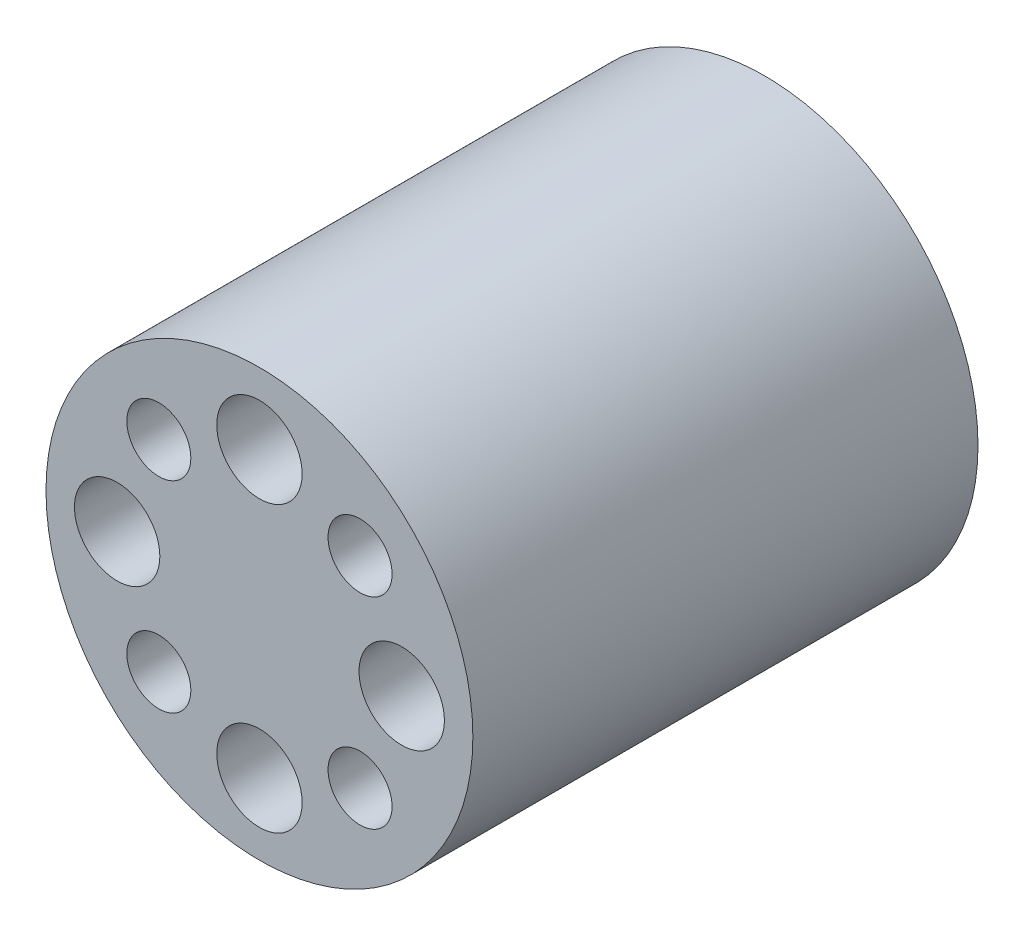
ISO-10303-21;
HEADER;
FILE_DESCRIPTION(('STEP AP214'),'2;1');
FILE_NAME('part.step','',(''),(''),'','','');
FILE_SCHEMA(('AUTOMOTIVE_DESIGN { 1 0 10303 214 1 1 1 1 }'));
ENDSEC;
DATA;
#1=APPLICATION_CONTEXT('core data for automotive mechanical design processes');
#2=APPLICATION_PROTOCOL_DEFINITION('international standard','automotive_design',2000,#1);
#3=PRODUCT_CONTEXT('',#1,'mechanical');
#4=PRODUCT('Part','Part','',(#3));
#5=PRODUCT_RELATED_PRODUCT_CATEGORY('part','',(#4));
#6=PRODUCT_DEFINITION_FORMATION('','',#4);
#7=PRODUCT_DEFINITION_CONTEXT('part definition',#1,'design');
#8=PRODUCT_DEFINITION('design','',#6,#7);
#9=PRODUCT_DEFINITION_SHAPE('','',#8);
#10=(LENGTH_UNIT() NAMED_UNIT(*) SI_UNIT(.MILLI.,.METRE.));
#11=(NAMED_UNIT(*) PLANE_ANGLE_UNIT() SI_UNIT($,.RADIAN.));
#12=(NAMED_UNIT(*) SI_UNIT($,.STERADIAN.) SOLID_ANGLE_UNIT());
#13=UNCERTAINTY_MEASURE_WITH_UNIT(LENGTH_MEASURE(1.E-05),#10,'distance_accuracy_value','');
#14=(GEOMETRIC_REPRESENTATION_CONTEXT(3) GLOBAL_UNCERTAINTY_ASSIGNED_CONTEXT((#13)) GLOBAL_UNIT_ASSIGNED_CONTEXT((#10,
#11,#12)) REPRESENTATION_CONTEXT('',''));
#15=CARTESIAN_POINT('',(0.,0.,0.));
#16=DIRECTION('',(0.,0.,1.));
#17=DIRECTION('',(1.,0.,0.));
#18=AXIS2_PLACEMENT_3D('',#15,#16,#17);
#19=CARTESIAN_POINT('',(10.,0.,35.5));
#20=DIRECTION('',(0.,0.,-1.));
#21=DIRECTION('',(-1.,0.,0.));
#22=AXIS2_PLACEMENT_3D('',#19,#20,#21);
#23=CYLINDRICAL_SURFACE('',#22,1.65);
#24=CARTESIAN_POINT('',(10.,0.,0.));
#25=DIRECTION('',(0.,0.,1.));
#26=DIRECTION('',(1.,0.,0.));
#27=AXIS2_PLACEMENT_3D('',#24,#25,#26);
#28=CIRCLE('',#27,1.65);
#29=CARTESIAN_POINT('',(11.65,0.,0.));
#30=VERTEX_POINT('',#29);
#31=EDGE_CURVE('E53',#30,#30,#28,.T.);
#32=ORIENTED_EDGE('',*,*,#31,.F.);
#33=EDGE_LOOP('',(#32));
#34=FACE_BOUND('',#33,.T.);
#35=CARTESIAN_POINT('',(10.,0.,6.));
#36=DIRECTION('',(0.,0.,1.));
#37=DIRECTION('',(1.,0.,0.));
#38=AXIS2_PLACEMENT_3D('',#35,#36,#37);
#39=CIRCLE('',#38,1.65);
#40=CARTESIAN_POINT('',(11.65,0.,6.));
#41=VERTEX_POINT('',#40);
#42=EDGE_CURVE('E79',#41,#41,#39,.T.);
#43=ORIENTED_EDGE('',*,*,#42,.T.);
#44=EDGE_LOOP('',(#43));
#45=FACE_BOUND('',#44,.T.);
#46=ADVANCED_FACE('F41',(#34,#45),#23,.F.);
#47=CARTESIAN_POINT('',(0.,-10.,35.5));
#48=DIRECTION('',(0.,0.,-1.));
#49=DIRECTION('',(-1.,0.,0.));
#50=AXIS2_PLACEMENT_3D('',#47,#48,#49);
#51=CYLINDRICAL_SURFACE('',#50,1.65);
#52=CARTESIAN_POINT('',(0.,-10.,0.));
#53=DIRECTION('',(0.,0.,1.));
#54=DIRECTION('',(1.,0.,0.));
#55=AXIS2_PLACEMENT_3D('',#52,#53,#54);
#56=CIRCLE('',#55,1.65);
#57=CARTESIAN_POINT('',(1.65,-10.,0.));
#58=VERTEX_POINT('',#57);
#59=EDGE_CURVE('E65',#58,#58,#56,.T.);
#60=ORIENTED_EDGE('',*,*,#59,.F.);
#61=EDGE_LOOP('',(#60));
#62=FACE_BOUND('',#61,.T.);
#63=CARTESIAN_POINT('',(0.,-10.,6.));
#64=DIRECTION('',(0.,0.,1.));
#65=DIRECTION('',(1.,0.,0.));
#66=AXIS2_PLACEMENT_3D('',#63,#64,#65);
#67=CIRCLE('',#66,1.65);
#68=CARTESIAN_POINT('',(1.65,-10.,6.));
#69=VERTEX_POINT('',#68);
#70=EDGE_CURVE('E95',#69,#69,#67,.T.);
#71=ORIENTED_EDGE('',*,*,#70,.T.);
#72=EDGE_LOOP('',(#71));
#73=FACE_BOUND('',#72,.T.);
#74=ADVANCED_FACE('F75',(#62,#73),#51,.F.);
#75=CARTESIAN_POINT('',(-10.,0.,35.5));
#76=DIRECTION('',(0.,0.,-1.));
#77=DIRECTION('',(-1.,0.,0.));
#78=AXIS2_PLACEMENT_3D('',#75,#76,#77);
#79=CYLINDRICAL_SURFACE('',#78,1.65);
#80=CARTESIAN_POINT('',(-10.,0.,0.));
#81=DIRECTION('',(0.,0.,1.));
#82=DIRECTION('',(1.,0.,0.));
#83=AXIS2_PLACEMENT_3D('',#80,#81,#82);
#84=CIRCLE('',#83,1.65);
#85=CARTESIAN_POINT('',(-8.35,0.,0.));
#86=VERTEX_POINT('',#85);
#87=EDGE_CURVE('E61',#86,#86,#84,.T.);
#88=ORIENTED_EDGE('',*,*,#87,.F.);
#89=EDGE_LOOP('',(#88));
#90=FACE_BOUND('',#89,.T.);
#91=CARTESIAN_POINT('',(-10.,0.,6.));
#92=DIRECTION('',(0.,0.,1.));
#93=DIRECTION('',(1.,0.,0.));
#94=AXIS2_PLACEMENT_3D('',#91,#92,#93);
#95=CIRCLE('',#94,1.65);
#96=CARTESIAN_POINT('',(-8.35,0.,6.));
#97=VERTEX_POINT('',#96);
#98=EDGE_CURVE('E105',#97,#97,#95,.T.);
#99=ORIENTED_EDGE('',*,*,#98,.T.);
#100=EDGE_LOOP('',(#99));
#101=FACE_BOUND('',#100,.T.);
#102=ADVANCED_FACE('F157',(#90,#101),#79,.F.);
#103=CARTESIAN_POINT('',(0.,10.,35.5));
#104=DIRECTION('',(0.,0.,-1.));
#105=DIRECTION('',(-1.,0.,0.));
#106=AXIS2_PLACEMENT_3D('',#103,#104,#105);
#107=CYLINDRICAL_SURFACE('',#106,1.65);
#108=CARTESIAN_POINT('',(0.,10.,0.));
#109=DIRECTION('',(0.,0.,1.));
#110=DIRECTION('',(1.,0.,0.));
#111=AXIS2_PLACEMENT_3D('',#108,#109,#110);
#112=CIRCLE('',#111,1.65);
#113=CARTESIAN_POINT('',(1.65,10.,0.));
#114=VERTEX_POINT('',#113);
#115=EDGE_CURVE('E58',#114,#114,#112,.T.);
#116=ORIENTED_EDGE('',*,*,#115,.F.);
#117=EDGE_LOOP('',(#116));
#118=FACE_BOUND('',#117,.T.);
#119=CARTESIAN_POINT('',(0.,10.,6.));
#120=DIRECTION('',(0.,0.,1.));
#121=DIRECTION('',(1.,0.,0.));
#122=AXIS2_PLACEMENT_3D('',#119,#120,#121);
#123=CIRCLE('',#122,1.65);
#124=CARTESIAN_POINT('',(1.65,10.,6.));
#125=VERTEX_POINT('',#124);
#126=EDGE_CURVE('E85',#125,#125,#123,.T.);
#127=ORIENTED_EDGE('',*,*,#126,.T.);
#128=EDGE_LOOP('',(#127));
#129=FACE_BOUND('',#128,.T.);
#130=ADVANCED_FACE('F43',(#118,#129),#107,.F.);
#131=CARTESIAN_POINT('',(0.,0.,35.5));
#132=DIRECTION('',(0.,0.,-1.));
#133=DIRECTION('',(-1.,0.,0.));
#134=AXIS2_PLACEMENT_3D('',#131,#132,#133);
#135=CYLINDRICAL_SURFACE('',#134,15.);
#136=CARTESIAN_POINT('',(0.,0.,35.5));
#137=DIRECTION('',(0.,0.,1.));
#138=DIRECTION('',(1.,0.,0.));
#139=AXIS2_PLACEMENT_3D('',#136,#137,#138);
#140=CIRCLE('',#139,15.);
#141=CARTESIAN_POINT('',(15.,0.,35.5));
#142=VERTEX_POINT('',#141);
#143=EDGE_CURVE('E11',#142,#142,#140,.T.);
#144=ORIENTED_EDGE('',*,*,#143,.F.);
#145=EDGE_LOOP('',(#144));
#146=FACE_BOUND('',#145,.T.);
#147=CARTESIAN_POINT('',(0.,0.,0.));
#148=DIRECTION('',(0.,0.,1.));
#149=DIRECTION('',(1.,0.,0.));
#150=AXIS2_PLACEMENT_3D('',#147,#148,#149);
#151=CIRCLE('',#150,15.);
#152=CARTESIAN_POINT('',(15.,0.,0.));
#153=VERTEX_POINT('',#152);
#154=EDGE_CURVE('E45',#153,#153,#151,.T.);
#155=ORIENTED_EDGE('',*,*,#154,.T.);
#156=EDGE_LOOP('',(#155));
#157=FACE_BOUND('',#156,.T.);
#158=ADVANCED_FACE('F138',(#146,#157),#135,.T.);
#159=CARTESIAN_POINT('',(0.,0.,35.5));
#160=DIRECTION('',(0.,0.,1.));
#161=DIRECTION('',(1.,0.,0.));
#162=AXIS2_PLACEMENT_3D('',#159,#160,#161);
#163=PLANE('',#162);
#164=CARTESIAN_POINT('',(0.,10.,35.5));
#165=DIRECTION('',(0.,0.,1.));
#166=DIRECTION('',(1.,0.,0.));
#167=AXIS2_PLACEMENT_3D('',#164,#165,#166);
#168=CIRCLE('',#167,3.);
#169=CARTESIAN_POINT('',(3.,10.,35.5));
#170=VERTEX_POINT('',#169);
#171=EDGE_CURVE('E81',#170,#170,#168,.T.);
#172=ORIENTED_EDGE('',*,*,#171,.F.);
#173=EDGE_LOOP('',(#172));
#174=FACE_BOUND('',#173,.T.);
#175=CARTESIAN_POINT('',(10.,0.,35.5));
#176=DIRECTION('',(0.,0.,1.));
#177=DIRECTION('',(1.,0.,0.));
#178=AXIS2_PLACEMENT_3D('',#175,#176,#177);
#179=CIRCLE('',#178,3.);
#180=CARTESIAN_POINT('',(13.,0.,35.5));
#181=VERTEX_POINT('',#180);
#182=EDGE_CURVE('E88',#181,#181,#179,.T.);
#183=ORIENTED_EDGE('',*,*,#182,.F.);
#184=EDGE_LOOP('',(#183));
#185=FACE_BOUND('',#184,.T.);
#186=CARTESIAN_POINT('',(0.,-10.,35.5));
#187=DIRECTION('',(0.,0.,1.));
#188=DIRECTION('',(1.,0.,0.));
#189=AXIS2_PLACEMENT_3D('',#186,#187,#188);
#190=CIRCLE('',#189,3.);
#191=CARTESIAN_POINT('',(3.,-10.,35.5));
#192=VERTEX_POINT('',#191);
#193=EDGE_CURVE('E92',#192,#192,#190,.T.);
#194=ORIENTED_EDGE('',*,*,#193,.F.);
#195=EDGE_LOOP('',(#194));
#196=FACE_BOUND('',#195,.T.);
#197=CARTESIAN_POINT('',(-10.,0.,35.5));
#198=DIRECTION('',(0.,0.,1.));
#199=DIRECTION('',(1.,0.,0.));
#200=AXIS2_PLACEMENT_3D('',#197,#198,#199);
#201=CIRCLE('',#200,3.);
#202=CARTESIAN_POINT('',(-7.,0.,35.5));
#203=VERTEX_POINT('',#202);
#204=EDGE_CURVE('E102',#203,#203,#201,.T.);
#205=ORIENTED_EDGE('',*,*,#204,.F.);
#206=EDGE_LOOP('',(#205));
#207=FACE_BOUND('',#206,.T.);
#208=CARTESIAN_POINT('',(-7.07106781186546,-7.07106781186549,35.5));
#209=DIRECTION('',(0.,0.,1.));
#210=DIRECTION('',(1.,0.,0.));
#211=AXIS2_PLACEMENT_3D('',#208,#209,#210);
#212=CIRCLE('',#211,2.25);
#213=CARTESIAN_POINT('',(-4.82106781186546,-7.07106781186549,35.5));
#214=VERTEX_POINT('',#213);
#215=EDGE_CURVE('E122',#214,#214,#212,.T.);
#216=ORIENTED_EDGE('',*,*,#215,.F.);
#217=EDGE_LOOP('',(#216));
#218=FACE_BOUND('',#217,.T.);
#219=CARTESIAN_POINT('',(7.07106781186549,-7.07106781186547,35.5));
#220=DIRECTION('',(0.,0.,1.));
#221=DIRECTION('',(1.,0.,0.));
#222=AXIS2_PLACEMENT_3D('',#219,#220,#221);
#223=CIRCLE('',#222,2.25);
#224=CARTESIAN_POINT('',(9.32106781186549,-7.07106781186547,35.5));
#225=VERTEX_POINT('',#224);
#226=EDGE_CURVE('E116',#225,#225,#223,.T.);
#227=ORIENTED_EDGE('',*,*,#226,.F.);
#228=EDGE_LOOP('',(#227));
#229=FACE_BOUND('',#228,.T.);
#230=CARTESIAN_POINT('',(7.07106781186546,7.07106781186549,35.5));
#231=DIRECTION('',(0.,0.,1.));
#232=DIRECTION('',(1.,0.,0.));
#233=AXIS2_PLACEMENT_3D('',#230,#231,#232);
#234=CIRCLE('',#233,2.25);
#235=CARTESIAN_POINT('',(9.32106781186547,7.07106781186549,35.5));
#236=VERTEX_POINT('',#235);
#237=EDGE_CURVE('E110',#236,#236,#234,.T.);
#238=ORIENTED_EDGE('',*,*,#237,.F.);
#239=EDGE_LOOP('',(#238));
#240=FACE_BOUND('',#239,.T.);
#241=CARTESIAN_POINT('',(-7.07106781186549,7.07106781186546,35.5));
#242=DIRECTION('',(0.,0.,1.));
#243=DIRECTION('',(1.,0.,0.));
#244=AXIS2_PLACEMENT_3D('',#241,#242,#243);
#245=CIRCLE('',#244,2.25);
#246=CARTESIAN_POINT('',(-4.82106781186549,7.07106781186546,35.5));
#247=VERTEX_POINT('',#246);
#248=EDGE_CURVE('E56',#247,#247,#245,.T.);
#249=ORIENTED_EDGE('',*,*,#248,.F.);
#250=EDGE_LOOP('',(#249));
#251=FACE_BOUND('',#250,.T.);
#252=ORIENTED_EDGE('',*,*,#143,.T.);
#253=EDGE_LOOP('',(#252));
#254=FACE_BOUND('',#253,.T.);
#255=ADVANCED_FACE('F136',(#174,#185,#196,#207,#218,#229,#240,#251,#254),#163,.T.);
#256=CARTESIAN_POINT('',(0.,0.,0.));
#257=DIRECTION('',(0.,0.,1.));
#258=DIRECTION('',(1.,0.,0.));
#259=AXIS2_PLACEMENT_3D('',#256,#257,#258);
#260=PLANE('',#259);
#261=ORIENTED_EDGE('',*,*,#115,.T.);
#262=EDGE_LOOP('',(#261));
#263=FACE_BOUND('',#262,.T.);
#264=ORIENTED_EDGE('',*,*,#87,.T.);
#265=EDGE_LOOP('',(#264));
#266=FACE_BOUND('',#265,.T.);
#267=ORIENTED_EDGE('',*,*,#59,.T.);
#268=EDGE_LOOP('',(#267));
#269=FACE_BOUND('',#268,.T.);
#270=ORIENTED_EDGE('',*,*,#31,.T.);
#271=EDGE_LOOP('',(#270));
#272=FACE_BOUND('',#271,.T.);
#273=ORIENTED_EDGE('',*,*,#154,.F.);
#274=EDGE_LOOP('',(#273));
#275=FACE_BOUND('',#274,.T.);
#276=ADVANCED_FACE('F70',(#263,#266,#269,#272,#275),#260,.F.);
#277=CARTESIAN_POINT('',(-7.07106781186549,7.07106781186546,25.5));
#278=DIRECTION('',(0.,0.,1.));
#279=DIRECTION('',(1.,0.,0.));
#280=AXIS2_PLACEMENT_3D('',#277,#278,#279);
#281=CYLINDRICAL_SURFACE('',#280,2.25);
#282=CARTESIAN_POINT('',(-7.07106781186549,7.07106781186546,25.5));
#283=DIRECTION('',(0.,0.,1.));
#284=DIRECTION('',(1.,0.,0.));
#285=AXIS2_PLACEMENT_3D('',#282,#283,#284);
#286=CIRCLE('',#285,2.25);
#287=CARTESIAN_POINT('',(-4.82106781186549,7.07106781186546,25.5));
#288=VERTEX_POINT('',#287);
#289=EDGE_CURVE('E62',#288,#288,#286,.T.);
#290=ORIENTED_EDGE('',*,*,#289,.F.);
#291=EDGE_LOOP('',(#290));
#292=FACE_BOUND('',#291,.T.);
#293=ORIENTED_EDGE('',*,*,#248,.T.);
#294=EDGE_LOOP('',(#293));
#295=FACE_BOUND('',#294,.T.);
#296=ADVANCED_FACE('F134',(#292,#295),#281,.F.);
#297=CARTESIAN_POINT('',(0.,0.,25.5));
#298=DIRECTION('',(0.,0.,1.));
#299=DIRECTION('',(1.,0.,0.));
#300=AXIS2_PLACEMENT_3D('',#297,#298,#299);
#301=PLANE('',#300);
#302=ORIENTED_EDGE('',*,*,#289,.T.);
#303=EDGE_LOOP('',(#302));
#304=FACE_BOUND('',#303,.T.);
#305=ADVANCED_FACE('F191',(#304),#301,.T.);
#306=CARTESIAN_POINT('',(7.07106781186546,7.07106781186549,25.5));
#307=DIRECTION('',(0.,0.,1.));
#308=DIRECTION('',(1.,0.,0.));
#309=AXIS2_PLACEMENT_3D('',#306,#307,#308);
#310=CYLINDRICAL_SURFACE('',#309,2.25);
#311=CARTESIAN_POINT('',(7.07106781186546,7.07106781186549,25.5));
#312=DIRECTION('',(0.,0.,1.));
#313=DIRECTION('',(1.,0.,0.));
#314=AXIS2_PLACEMENT_3D('',#311,#312,#313);
#315=CIRCLE('',#314,2.25);
#316=CARTESIAN_POINT('',(9.32106781186547,7.07106781186549,25.5));
#317=VERTEX_POINT('',#316);
#318=EDGE_CURVE('E113',#317,#317,#315,.T.);
#319=ORIENTED_EDGE('',*,*,#318,.F.);
#320=EDGE_LOOP('',(#319));
#321=FACE_BOUND('',#320,.T.);
#322=ORIENTED_EDGE('',*,*,#237,.T.);
#323=EDGE_LOOP('',(#322));
#324=FACE_BOUND('',#323,.T.);
#325=ADVANCED_FACE('F188',(#321,#324),#310,.F.);
#326=CARTESIAN_POINT('',(7.07106781186546,7.07106781186549,25.5));
#327=DIRECTION('',(0.,0.,1.));
#328=DIRECTION('',(1.,0.,0.));
#329=AXIS2_PLACEMENT_3D('',#326,#327,#328);
#330=PLANE('',#329);
#331=ORIENTED_EDGE('',*,*,#318,.T.);
#332=EDGE_LOOP('',(#331));
#333=FACE_BOUND('',#332,.T.);
#334=ADVANCED_FACE('F190',(#333),#330,.T.);
#335=CARTESIAN_POINT('',(7.07106781186549,-7.07106781186547,25.5));
#336=DIRECTION('',(0.,0.,1.));
#337=DIRECTION('',(1.,0.,0.));
#338=AXIS2_PLACEMENT_3D('',#335,#336,#337);
#339=CYLINDRICAL_SURFACE('',#338,2.25);
#340=CARTESIAN_POINT('',(7.07106781186549,-7.07106781186547,25.5));
#341=DIRECTION('',(0.,0.,1.));
#342=DIRECTION('',(1.,0.,0.));
#343=AXIS2_PLACEMENT_3D('',#340,#341,#342);
#344=CIRCLE('',#343,2.25);
#345=CARTESIAN_POINT('',(9.32106781186549,-7.07106781186547,25.5));
#346=VERTEX_POINT('',#345);
#347=EDGE_CURVE('E119',#346,#346,#344,.T.);
#348=ORIENTED_EDGE('',*,*,#347,.F.);
#349=EDGE_LOOP('',(#348));
#350=FACE_BOUND('',#349,.T.);
#351=ORIENTED_EDGE('',*,*,#226,.T.);
#352=EDGE_LOOP('',(#351));
#353=FACE_BOUND('',#352,.T.);
#354=ADVANCED_FACE('F198',(#350,#353),#339,.F.);
#355=CARTESIAN_POINT('',(7.07106781186549,-7.07106781186547,25.5));
#356=DIRECTION('',(0.,0.,1.));
#357=DIRECTION('',(1.,0.,0.));
#358=AXIS2_PLACEMENT_3D('',#355,#356,#357);
#359=PLANE('',#358);
#360=ORIENTED_EDGE('',*,*,#347,.T.);
#361=EDGE_LOOP('',(#360));
#362=FACE_BOUND('',#361,.T.);
#363=ADVANCED_FACE('F205',(#362),#359,.T.);
#364=CARTESIAN_POINT('',(-7.07106781186546,-7.07106781186549,25.5));
#365=DIRECTION('',(0.,0.,1.));
#366=DIRECTION('',(1.,0.,0.));
#367=AXIS2_PLACEMENT_3D('',#364,#365,#366);
#368=CYLINDRICAL_SURFACE('',#367,2.25);
#369=CARTESIAN_POINT('',(-7.07106781186546,-7.07106781186549,25.5));
#370=DIRECTION('',(0.,0.,1.));
#371=DIRECTION('',(1.,0.,0.));
#372=AXIS2_PLACEMENT_3D('',#369,#370,#371);
#373=CIRCLE('',#372,2.25);
#374=CARTESIAN_POINT('',(-4.82106781186546,-7.07106781186549,25.5));
#375=VERTEX_POINT('',#374);
#376=EDGE_CURVE('E125',#375,#375,#373,.T.);
#377=ORIENTED_EDGE('',*,*,#376,.F.);
#378=EDGE_LOOP('',(#377));
#379=FACE_BOUND('',#378,.T.);
#380=ORIENTED_EDGE('',*,*,#215,.T.);
#381=EDGE_LOOP('',(#380));
#382=FACE_BOUND('',#381,.T.);
#383=ADVANCED_FACE('F209',(#379,#382),#368,.F.);
#384=CARTESIAN_POINT('',(-7.07106781186546,-7.07106781186549,25.5));
#385=DIRECTION('',(0.,0.,1.));
#386=DIRECTION('',(1.,0.,0.));
#387=AXIS2_PLACEMENT_3D('',#384,#385,#386);
#388=PLANE('',#387);
#389=ORIENTED_EDGE('',*,*,#376,.T.);
#390=EDGE_LOOP('',(#389));
#391=FACE_BOUND('',#390,.T.);
#392=ADVANCED_FACE('F177',(#391),#388,.T.);
#393=CARTESIAN_POINT('',(-10.,0.,-8.48528137423857));
#394=DIRECTION('',(0.,0.,1.));
#395=DIRECTION('',(1.,0.,0.));
#396=AXIS2_PLACEMENT_3D('',#393,#394,#395);
#397=CYLINDRICAL_SURFACE('',#396,3.);
#398=CARTESIAN_POINT('',(-10.,0.,6.));
#399=DIRECTION('',(0.,0.,1.));
#400=DIRECTION('',(1.,0.,0.));
#401=AXIS2_PLACEMENT_3D('',#398,#399,#400);
#402=CIRCLE('',#401,3.);
#403=CARTESIAN_POINT('',(-7.,0.,6.));
#404=VERTEX_POINT('',#403);
#405=EDGE_CURVE('E96',#404,#404,#402,.F.);
#406=ORIENTED_EDGE('',*,*,#405,.T.);
#407=EDGE_LOOP('',(#406));
#408=FACE_BOUND('',#407,.T.);
#409=ORIENTED_EDGE('',*,*,#204,.T.);
#410=EDGE_LOOP('',(#409));
#411=FACE_BOUND('',#410,.T.);
#412=ADVANCED_FACE('F172',(#408,#411),#397,.F.);
#413=CARTESIAN_POINT('',(0.,0.,6.));
#414=DIRECTION('',(0.,0.,1.));
#415=DIRECTION('',(1.,0.,0.));
#416=AXIS2_PLACEMENT_3D('',#413,#414,#415);
#417=PLANE('',#416);
#418=ORIENTED_EDGE('',*,*,#98,.F.);
#419=EDGE_LOOP('',(#418));
#420=FACE_BOUND('',#419,.T.);
#421=ORIENTED_EDGE('',*,*,#405,.F.);
#422=EDGE_LOOP('',(#421));
#423=FACE_BOUND('',#422,.T.);
#424=ADVANCED_FACE('F168',(#420,#423),#417,.T.);
#425=CARTESIAN_POINT('',(0.,-10.,-8.48528137423857));
#426=DIRECTION('',(0.,0.,1.));
#427=DIRECTION('',(1.,0.,0.));
#428=AXIS2_PLACEMENT_3D('',#425,#426,#427);
#429=CYLINDRICAL_SURFACE('',#428,3.);
#430=CARTESIAN_POINT('',(0.,-10.,6.));
#431=DIRECTION('',(0.,0.,1.));
#432=DIRECTION('',(1.,0.,0.));
#433=AXIS2_PLACEMENT_3D('',#430,#431,#432);
#434=CIRCLE('',#433,3.);
#435=CARTESIAN_POINT('',(3.,-10.,6.));
#436=VERTEX_POINT('',#435);
#437=EDGE_CURVE('E99',#436,#436,#434,.F.);
#438=ORIENTED_EDGE('',*,*,#437,.T.);
#439=EDGE_LOOP('',(#438));
#440=FACE_BOUND('',#439,.T.);
#441=ORIENTED_EDGE('',*,*,#193,.T.);
#442=EDGE_LOOP('',(#441));
#443=FACE_BOUND('',#442,.T.);
#444=ADVANCED_FACE('F171',(#440,#443),#429,.F.);
#445=CARTESIAN_POINT('',(0.,0.,6.));
#446=DIRECTION('',(0.,0.,1.));
#447=DIRECTION('',(1.,0.,0.));
#448=AXIS2_PLACEMENT_3D('',#445,#446,#447);
#449=PLANE('',#448);
#450=ORIENTED_EDGE('',*,*,#70,.F.);
#451=EDGE_LOOP('',(#450));
#452=FACE_BOUND('',#451,.T.);
#453=ORIENTED_EDGE('',*,*,#437,.F.);
#454=EDGE_LOOP('',(#453));
#455=FACE_BOUND('',#454,.T.);
#456=ADVANCED_FACE('F355',(#452,#455),#449,.T.);
#457=CARTESIAN_POINT('',(10.,0.,-8.48528137423857));
#458=DIRECTION('',(0.,0.,1.));
#459=DIRECTION('',(1.,0.,0.));
#460=AXIS2_PLACEMENT_3D('',#457,#458,#459);
#461=CYLINDRICAL_SURFACE('',#460,3.);
#462=CARTESIAN_POINT('',(10.,0.,6.));
#463=DIRECTION('',(0.,0.,1.));
#464=DIRECTION('',(1.,0.,0.));
#465=AXIS2_PLACEMENT_3D('',#462,#463,#464);
#466=CIRCLE('',#465,3.);
#467=CARTESIAN_POINT('',(13.,0.,6.));
#468=VERTEX_POINT('',#467);
#469=EDGE_CURVE('E82',#468,#468,#466,.F.);
#470=ORIENTED_EDGE('',*,*,#469,.T.);
#471=EDGE_LOOP('',(#470));
#472=FACE_BOUND('',#471,.T.);
#473=ORIENTED_EDGE('',*,*,#182,.T.);
#474=EDGE_LOOP('',(#473));
#475=FACE_BOUND('',#474,.T.);
#476=ADVANCED_FACE('F365',(#472,#475),#461,.F.);
#477=CARTESIAN_POINT('',(0.,0.,6.));
#478=DIRECTION('',(0.,0.,1.));
#479=DIRECTION('',(1.,0.,0.));
#480=AXIS2_PLACEMENT_3D('',#477,#478,#479);
#481=PLANE('',#480);
#482=ORIENTED_EDGE('',*,*,#469,.F.);
#483=EDGE_LOOP('',(#482));
#484=FACE_BOUND('',#483,.T.);
#485=ORIENTED_EDGE('',*,*,#42,.F.);
#486=EDGE_LOOP('',(#485));
#487=FACE_BOUND('',#486,.T.);
#488=ADVANCED_FACE('F375',(#484,#487),#481,.T.);
#489=CARTESIAN_POINT('',(0.,10.,-8.48528137423857));
#490=DIRECTION('',(0.,0.,1.));
#491=DIRECTION('',(1.,0.,0.));
#492=AXIS2_PLACEMENT_3D('',#489,#490,#491);
#493=CYLINDRICAL_SURFACE('',#492,3.);
#494=CARTESIAN_POINT('',(0.,10.,6.));
#495=DIRECTION('',(0.,0.,1.));
#496=DIRECTION('',(1.,0.,0.));
#497=AXIS2_PLACEMENT_3D('',#494,#495,#496);
#498=CIRCLE('',#497,3.);
#499=CARTESIAN_POINT('',(3.,10.,6.));
#500=VERTEX_POINT('',#499);
#501=EDGE_CURVE('E127',#500,#500,#498,.F.);
#502=ORIENTED_EDGE('',*,*,#501,.T.);
#503=EDGE_LOOP('',(#502));
#504=FACE_BOUND('',#503,.T.);
#505=ORIENTED_EDGE('',*,*,#171,.T.);
#506=EDGE_LOOP('',(#505));
#507=FACE_BOUND('',#506,.T.);
#508=ADVANCED_FACE('F385',(#504,#507),#493,.F.);
#509=CARTESIAN_POINT('',(0.,0.,6.));
#510=DIRECTION('',(0.,0.,1.));
#511=DIRECTION('',(1.,0.,0.));
#512=AXIS2_PLACEMENT_3D('',#509,#510,#511);
#513=PLANE('',#512);
#514=ORIENTED_EDGE('',*,*,#126,.F.);
#515=EDGE_LOOP('',(#514));
#516=FACE_BOUND('',#515,.T.);
#517=ORIENTED_EDGE('',*,*,#501,.F.);
#518=EDGE_LOOP('',(#517));
#519=FACE_BOUND('',#518,.T.);
#520=ADVANCED_FACE('F395',(#516,#519),#513,.T.);
#521=CLOSED_SHELL('',(#46,#74,#102,#130,#158,#255,#276,#296,#305,#325,#334,#354,#363,#383,#392,
#412,#424,#444,#456,#476,#488,#508,#520));
#522=MANIFOLD_SOLID_BREP('B2',#521);
#523=ADVANCED_BREP_SHAPE_REPRESENTATION('',(#18,#522),#14);
#524=SHAPE_DEFINITION_REPRESENTATION(#9,#523);
ENDSEC;
END-ISO-10303-21;
